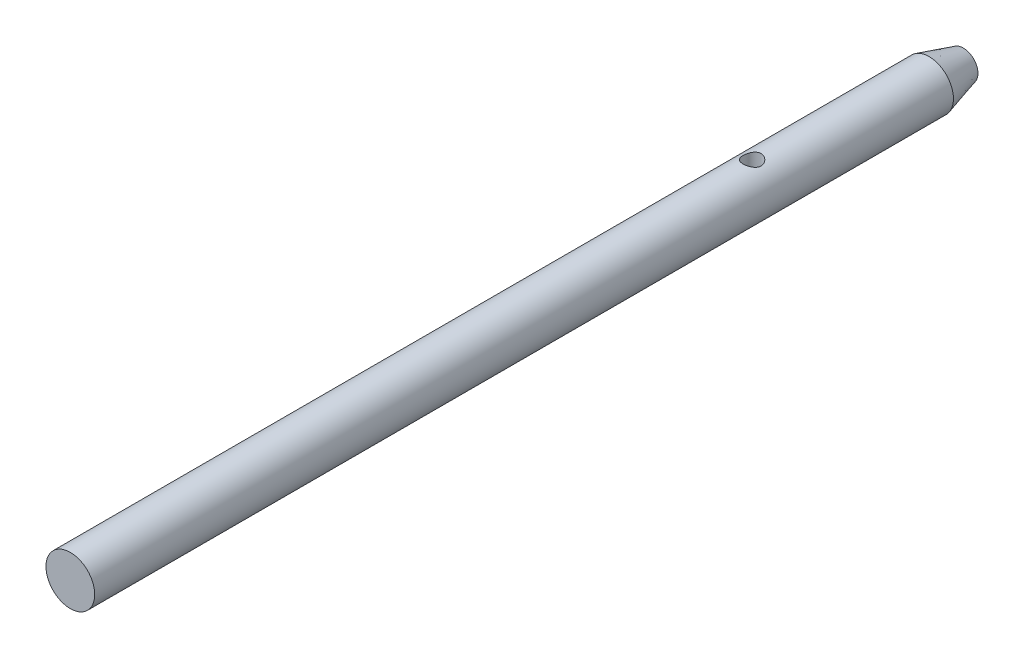
ISO-10303-21;
HEADER;
FILE_DESCRIPTION(('STEP AP214'),'2;1');
FILE_NAME('part.step','',(''),(''),'','','');
FILE_SCHEMA(('AUTOMOTIVE_DESIGN { 1 0 10303 214 1 1 1 1 }'));
ENDSEC;
DATA;
#1=APPLICATION_CONTEXT('core data for automotive mechanical design processes');
#2=APPLICATION_PROTOCOL_DEFINITION('international standard','automotive_design',2000,#1);
#3=PRODUCT_CONTEXT('',#1,'mechanical');
#4=PRODUCT('Part','Part','',(#3));
#5=PRODUCT_RELATED_PRODUCT_CATEGORY('part','',(#4));
#6=PRODUCT_DEFINITION_FORMATION('','',#4);
#7=PRODUCT_DEFINITION_CONTEXT('part definition',#1,'design');
#8=PRODUCT_DEFINITION('design','',#6,#7);
#9=PRODUCT_DEFINITION_SHAPE('','',#8);
#10=(LENGTH_UNIT() NAMED_UNIT(*) SI_UNIT(.MILLI.,.METRE.));
#11=(NAMED_UNIT(*) PLANE_ANGLE_UNIT() SI_UNIT($,.RADIAN.));
#12=(NAMED_UNIT(*) SI_UNIT($,.STERADIAN.) SOLID_ANGLE_UNIT());
#13=UNCERTAINTY_MEASURE_WITH_UNIT(LENGTH_MEASURE(1.E-05),#10,'distance_accuracy_value','');
#14=(GEOMETRIC_REPRESENTATION_CONTEXT(3) GLOBAL_UNCERTAINTY_ASSIGNED_CONTEXT((#13)) GLOBAL_UNIT_ASSIGNED_CONTEXT((#10,
#11,#12)) REPRESENTATION_CONTEXT('',''));
#15=CARTESIAN_POINT('',(0.,0.,0.));
#16=DIRECTION('',(0.,0.,1.));
#17=DIRECTION('',(1.,0.,0.));
#18=AXIS2_PLACEMENT_3D('',#15,#16,#17);
#19=CARTESIAN_POINT('',(0.,0.,78.2));
#20=DIRECTION('',(0.,0.,-1.));
#21=DIRECTION('',(-1.,0.,0.));
#22=AXIS2_PLACEMENT_3D('',#19,#20,#21);
#23=CYLINDRICAL_SURFACE('',#22,2.135);
#24=CARTESIAN_POINT('',(0.,-2.135,19.29));
#25=CARTESIAN_POINT('',(-0.0428238272525146,-2.1350009940098,19.2900013401032));
#26=CARTESIAN_POINT('',(-0.085638357309757,-2.1337002612511,19.2865070010426));
#27=CARTESIAN_POINT('',(-0.169990093325728,-2.12864112528912,19.2726767903511));
#28=CARTESIAN_POINT('',(-0.211527445228046,-2.12488300399346,19.2623417034779));
#29=CARTESIAN_POINT('',(-0.292096286958867,-2.11531311575473,19.2352440665917));
#30=CARTESIAN_POINT('',(-0.331132368726044,-2.10950524735474,19.2184937130613));
#31=CARTESIAN_POINT('',(-0.405838231838684,-2.09641609464971,19.179102199385));
#32=CARTESIAN_POINT('',(-0.441507132774192,-2.08913442654936,19.1564595043622));
#33=CARTESIAN_POINT('',(-0.509946974480535,-2.07351338662565,19.1049435094094));
#34=CARTESIAN_POINT('',(-0.542559501226242,-2.06514462926806,19.0758687440301));
#35=CARTESIAN_POINT('',(-0.602572539428274,-2.04843928389962,19.0127416591513));
#36=CARTESIAN_POINT('',(-0.629971516065413,-2.04010270606756,18.9786878790791));
#37=CARTESIAN_POINT('',(-0.679773875960378,-2.02406609291131,18.9050369260246));
#38=CARTESIAN_POINT('',(-0.701955732021397,-2.01640087631867,18.8652816203101));
#39=CARTESIAN_POINT('',(-0.739248245154464,-2.00303081190102,18.7822761745771));
#40=CARTESIAN_POINT('',(-0.754361641878282,-1.99732520478256,18.7390273962224));
#41=CARTESIAN_POINT('',(-0.77646666746385,-1.98883394910982,18.6520839605847));
#42=CARTESIAN_POINT('',(-0.783760003468851,-1.9859402684505,18.6084769127366));
#43=CARTESIAN_POINT('',(-0.790961267136431,-1.98308390868599,18.5205692854069));
#44=CARTESIAN_POINT('',(-0.790872142551026,-1.98312005972448,18.4762689897974));
#45=CARTESIAN_POINT('',(-0.783542156409132,-1.98602593820376,18.3909682173418));
#46=CARTESIAN_POINT('',(-0.776716560523546,-1.98873113118037,18.3499254196212));
#47=CARTESIAN_POINT('',(-0.756792752812186,-1.99639737240981,18.2696154024085));
#48=CARTESIAN_POINT('',(-0.743693621648512,-2.00135875128379,18.2303484440751));
#49=CARTESIAN_POINT('',(-0.71136124656501,-2.01307961097668,18.1538464392683));
#50=CARTESIAN_POINT('',(-0.692018430804901,-2.01987082265867,18.1166627767925));
#51=CARTESIAN_POINT('',(-0.647824079050184,-2.03447524644867,18.0459472008045));
#52=CARTESIAN_POINT('',(-0.622970676916933,-2.04228880440199,18.0124165301142));
#53=CARTESIAN_POINT('',(-0.566549083268955,-2.05868010145001,17.9476555665624));
#54=CARTESIAN_POINT('',(-0.534648400066002,-2.0672744243697,17.9167184528563));
#55=CARTESIAN_POINT('',(-0.466011737558566,-2.08381932168957,17.8605471978208));
#56=CARTESIAN_POINT('',(-0.429275055022359,-2.09176980219265,17.8353138873685));
#57=CARTESIAN_POINT('',(-0.351277286357768,-2.1062819256944,17.7909545383481));
#58=CARTESIAN_POINT('',(-0.309957626515841,-2.11282143315577,17.7719237361247));
#59=CARTESIAN_POINT('',(-0.22440127916676,-2.1236110947878,17.7411799790662));
#60=CARTESIAN_POINT('',(-0.180165860824172,-2.12786223774206,17.7294638632647));
#61=CARTESIAN_POINT('',(-0.0925029531778528,-2.1334236160906,17.7142401162244));
#62=CARTESIAN_POINT('',(-0.0491529536443193,-2.13487521076022,17.7103375278892));
#63=CARTESIAN_POINT('',(0.0376016534118486,-2.13510916486143,17.7097046980336));
#64=CARTESIAN_POINT('',(0.0810062472026761,-2.13389209764641,17.7129729158887));
#65=CARTESIAN_POINT('',(0.164947028448631,-2.12901880141476,17.7262870400513));
#66=CARTESIAN_POINT('',(0.205529853835498,-2.1254550058492,17.7360762592276));
#67=CARTESIAN_POINT('',(0.284450114556467,-2.11633938227223,17.7618186742843));
#68=CARTESIAN_POINT('',(0.322787256965835,-2.11078729557896,17.7777726722399));
#69=CARTESIAN_POINT('',(0.397376361250218,-2.0980445618673,17.8158967025966));
#70=CARTESIAN_POINT('',(0.43353526677633,-2.09081096072883,17.838234005388));
#71=CARTESIAN_POINT('',(0.501711238114375,-2.07550803529028,17.8883006531025));
#72=CARTESIAN_POINT('',(0.533726796945283,-2.06743840882917,17.9160319507536));
#73=CARTESIAN_POINT('',(0.594596845798324,-2.05078801172393,17.97794301208));
#74=CARTESIAN_POINT('',(0.623170812261933,-2.04220410524591,18.0123984525931));
#75=CARTESIAN_POINT('',(0.674184074189231,-2.02593678452183,18.0857865449927));
#76=CARTESIAN_POINT('',(0.696622894927866,-2.01825343998569,18.1247195430125));
#77=CARTESIAN_POINT('',(0.734732194833676,-2.00469605337354,18.2062344042863));
#78=CARTESIAN_POINT('',(0.750380651462302,-1.99882791579257,18.2488276111607));
#79=CARTESIAN_POINT('',(0.774184352563577,-1.98973091686073,18.3363211483014));
#80=CARTESIAN_POINT('',(0.782344066905023,-1.98650048124964,18.3812200854041));
#81=CARTESIAN_POINT('',(0.790544989748982,-1.98325016337511,18.4690199820063));
#82=CARTESIAN_POINT('',(0.791062925351209,-1.98304176816561,18.5118698191028));
#83=CARTESIAN_POINT('',(0.785180987190091,-1.98537795865399,18.5970114384919));
#84=CARTESIAN_POINT('',(0.778781734233246,-1.98792229729845,18.6393032705198));
#85=CARTESIAN_POINT('',(0.759614417893488,-1.99532229831176,18.720889328424));
#86=CARTESIAN_POINT('',(0.747035916789874,-2.00010898038455,18.7602348755795));
#87=CARTESIAN_POINT('',(0.716032262318212,-2.01141585481088,18.8362812631782));
#88=CARTESIAN_POINT('',(0.697605649861772,-2.0179364797127,18.8729814408015));
#89=CARTESIAN_POINT('',(0.654328772892164,-2.03239368747917,18.9447457343013));
#90=CARTESIAN_POINT('',(0.629196981181888,-2.04038582892592,18.9796287557718));
#91=CARTESIAN_POINT('',(0.573663824928454,-2.05668945480902,19.0448349487086));
#92=CARTESIAN_POINT('',(0.54326080829938,-2.06500103872617,19.0751566850142));
#93=CARTESIAN_POINT('',(0.476152929516309,-2.08152744529652,19.1319889157094));
#94=CARTESIAN_POINT('',(0.439202195132158,-2.08971464340947,19.1582183778302));
#95=CARTESIAN_POINT('',(0.361131124585872,-2.10461087772527,19.204083562761));
#96=CARTESIAN_POINT('',(0.320010649510992,-2.11131986465864,19.2237190658025));
#97=CARTESIAN_POINT('',(0.23334390006495,-2.12267357415785,19.2562136303387));
#98=CARTESIAN_POINT('',(0.187697765137357,-2.12724489208271,19.268834198597));
#99=CARTESIAN_POINT('',(0.0946967591149705,-2.13340685821257,19.2857246889787));
#100=CARTESIAN_POINT('',(0.0473426981359786,-2.13499890109995,19.289998518486));
#101=CARTESIAN_POINT('',(0.,-2.135,19.29));
#102=B_SPLINE_CURVE_WITH_KNOTS('',3,(#24,#25,#26,#27,#28,#29,#30,#31,#32,#33,#34,#35,#36,#37,
#38,#39,#40,#41,#42,#43,#44,#45,#46,#47,#48,#49,#50,#51,#52,#53,#54,#55,#56,#57,#58,#59,#60,#61,
#62,#63,#64,#65,#66,#67,#68,#69,#70,#71,#72,#73,#74,#75,#76,#77,#78,#79,#80,#81,#82,#83,#84,#85,
#86,#87,#88,#89,#90,#91,#92,#93,#94,#95,#96,#97,#98,#99,#100,#101),.UNSPECIFIED.,.T.,.F.,(4,2,2,
2,2,2,2,2,2,2,2,2,2,2,2,2,2,2,2,2,2,2,2,2,2,2,2,2,2,2,2,2,2,2,2,2,2,2,4),(0.,0.128296906151909,
0.256579096872609,0.384618602955328,0.512691495075932,0.645557490133345,0.778462539355701,
0.916269570445694,1.0540231447953,1.18624628604036,1.31841663199489,1.44291805088535,
1.56743772007746,1.6942736561903,1.82115261058118,1.95631650778028,2.09150008173078,
2.22867098807368,2.36578257631508,2.49576835788818,2.62572621517235,2.75084900285138,
2.87598807524934,3.00476618121446,3.13359099435013,3.26968911584709,3.4057977653605,
3.54234460250331,3.67880988467715,3.80672312123309,3.93462487873572,4.05882725883751,
4.18306065149938,4.31368056914014,4.44434149939483,4.5818128805035,4.7192888429054,
4.86119038481296,5.00302548198714),.UNSPECIFIED.);
#103=CARTESIAN_POINT('',(0.,-2.135,19.29));
#104=VERTEX_POINT('',#103);
#105=EDGE_CURVE('E58',#104,#104,#102,.T.);
#106=ORIENTED_EDGE('',*,*,#105,.F.);
#107=EDGE_LOOP('',(#106));
#108=FACE_BOUND('',#107,.T.);
#109=CARTESIAN_POINT('',(0.,2.135,17.71));
#110=CARTESIAN_POINT('',(0.04282382725251,2.1350009940098,17.7099986598968));
#111=CARTESIAN_POINT('',(0.0856383573097523,2.1337002612511,17.7134929989574));
#112=CARTESIAN_POINT('',(0.169990093325723,2.12864112528912,17.7273232096489));
#113=CARTESIAN_POINT('',(0.211527445228041,2.12488300399346,17.7376582965221));
#114=CARTESIAN_POINT('',(0.292096286958862,2.11531311575473,17.7647559334083));
#115=CARTESIAN_POINT('',(0.331132368726039,2.10950524735474,17.7815062869387));
#116=CARTESIAN_POINT('',(0.405838231838679,2.09641609464971,17.820897800615));
#117=CARTESIAN_POINT('',(0.441507132774188,2.08913442654937,17.8435404956378));
#118=CARTESIAN_POINT('',(0.509946974480531,2.07351338662565,17.8950564905906));
#119=CARTESIAN_POINT('',(0.542559501226237,2.06514462926806,17.9241312559699));
#120=CARTESIAN_POINT('',(0.602572539428269,2.04843928389962,17.9872583408487));
#121=CARTESIAN_POINT('',(0.629971516065409,2.04010270606756,18.0213121209209));
#122=CARTESIAN_POINT('',(0.679773875960374,2.02406609291131,18.0949630739754));
#123=CARTESIAN_POINT('',(0.701955732021394,2.01640087631867,18.1347183796899));
#124=CARTESIAN_POINT('',(0.739248245154461,2.00303081190102,18.2177238254229));
#125=CARTESIAN_POINT('',(0.754361641878278,1.99732520478256,18.2609726037776));
#126=CARTESIAN_POINT('',(0.776466667463845,1.98883394910982,18.3479160394153));
#127=CARTESIAN_POINT('',(0.783760003468847,1.9859402684505,18.3915230872634));
#128=CARTESIAN_POINT('',(0.790961267136426,1.98308390868599,18.4794307145931));
#129=CARTESIAN_POINT('',(0.790872142551021,1.98312005972448,18.5237310102026));
#130=CARTESIAN_POINT('',(0.783542156409127,1.98602593820376,18.6090317826582));
#131=CARTESIAN_POINT('',(0.776716560523542,1.98873113118037,18.6500745803788));
#132=CARTESIAN_POINT('',(0.756792752812181,1.99639737240981,18.7303845975915));
#133=CARTESIAN_POINT('',(0.743693621648508,2.00135875128379,18.7696515559249));
#134=CARTESIAN_POINT('',(0.711361246565005,2.01307961097669,18.8461535607317));
#135=CARTESIAN_POINT('',(0.692018430804897,2.01987082265867,18.8833372232075));
#136=CARTESIAN_POINT('',(0.647824079050179,2.03447524644867,18.9540527991955));
#137=CARTESIAN_POINT('',(0.622970676916928,2.04228880440199,18.9875834698858));
#138=CARTESIAN_POINT('',(0.566549083268951,2.05868010145001,19.0523444334376));
#139=CARTESIAN_POINT('',(0.534648400066,2.0672744243697,19.0832815471437));
#140=CARTESIAN_POINT('',(0.466011737558565,2.08381932168957,19.1394528021792));
#141=CARTESIAN_POINT('',(0.429275055022358,2.09176980219265,19.1646861126315));
#142=CARTESIAN_POINT('',(0.351277286357766,2.1062819256944,19.2090454616519));
#143=CARTESIAN_POINT('',(0.309957626515838,2.11282143315577,19.2280762638753));
#144=CARTESIAN_POINT('',(0.224401279166757,2.1236110947878,19.2588200209337));
#145=CARTESIAN_POINT('',(0.180165860824168,2.12786223774206,19.2705361367353));
#146=CARTESIAN_POINT('',(0.0925029531778487,2.13342361609059,19.2857598837756));
#147=CARTESIAN_POINT('',(0.0491529536443154,2.13487521076022,19.2896624721108));
#148=CARTESIAN_POINT('',(-0.0376016534118525,2.13510916486143,19.2902953019664));
#149=CARTESIAN_POINT('',(-0.0810062472026801,2.13389209764641,19.2870270841113));
#150=CARTESIAN_POINT('',(-0.164947028448636,2.12901880141476,19.2737129599486));
#151=CARTESIAN_POINT('',(-0.205529853835503,2.1254550058492,19.2639237407724));
#152=CARTESIAN_POINT('',(-0.284450114556471,2.11633938227223,19.2381813257157));
#153=CARTESIAN_POINT('',(-0.322787256965839,2.11078729557896,19.2222273277601));
#154=CARTESIAN_POINT('',(-0.397376361250221,2.0980445618673,19.1841032974034));
#155=CARTESIAN_POINT('',(-0.433535266776332,2.09081096072883,19.161765994612));
#156=CARTESIAN_POINT('',(-0.501711238114377,2.07550803529028,19.1116993468975));
#157=CARTESIAN_POINT('',(-0.533726796945286,2.06743840882917,19.0839680492464));
#158=CARTESIAN_POINT('',(-0.594596845798329,2.05078801172393,19.02205698792));
#159=CARTESIAN_POINT('',(-0.623170812261938,2.0422041052459,18.9876015474069));
#160=CARTESIAN_POINT('',(-0.674184074189236,2.02593678452183,18.9142134550073));
#161=CARTESIAN_POINT('',(-0.696622894927872,2.01825343998569,18.8752804569875));
#162=CARTESIAN_POINT('',(-0.734732194833681,2.00469605337354,18.7937655957137));
#163=CARTESIAN_POINT('',(-0.750380651462307,1.99882791579257,18.7511723888393));
#164=CARTESIAN_POINT('',(-0.774184352563582,1.98973091686073,18.6636788516986));
#165=CARTESIAN_POINT('',(-0.782344066905027,1.98650048124964,18.6187799145959));
#166=CARTESIAN_POINT('',(-0.790544989748987,1.9832501633751,18.5309800179937));
#167=CARTESIAN_POINT('',(-0.791062925351214,1.98304176816561,18.4881301808972));
#168=CARTESIAN_POINT('',(-0.785180987190095,1.98537795865398,18.4029885615081));
#169=CARTESIAN_POINT('',(-0.778781734233251,1.98792229729845,18.3606967294802));
#170=CARTESIAN_POINT('',(-0.759614417893492,1.99532229831176,18.279110671576));
#171=CARTESIAN_POINT('',(-0.747035916789878,2.00010898038454,18.2397651244205));
#172=CARTESIAN_POINT('',(-0.716032262318217,2.01141585481088,18.1637187368218));
#173=CARTESIAN_POINT('',(-0.697605649861776,2.0179364797127,18.1270185591985));
#174=CARTESIAN_POINT('',(-0.654328772892169,2.03239368747917,18.0552542656987));
#175=CARTESIAN_POINT('',(-0.629196981181893,2.04038582892592,18.0203712442282));
#176=CARTESIAN_POINT('',(-0.573663824928459,2.05668945480902,17.9551650512914));
#177=CARTESIAN_POINT('',(-0.543260808299386,2.06500103872616,17.9248433149858));
#178=CARTESIAN_POINT('',(-0.476152929516314,2.08152744529652,17.8680110842906));
#179=CARTESIAN_POINT('',(-0.439202195132161,2.08971464340947,17.8417816221698));
#180=CARTESIAN_POINT('',(-0.361131124585875,2.10461087772527,17.795916437239));
#181=CARTESIAN_POINT('',(-0.320010649510996,2.11131986465864,17.7762809341975));
#182=CARTESIAN_POINT('',(-0.233343900064955,2.12267357415785,17.7437863696613));
#183=CARTESIAN_POINT('',(-0.187697765137363,2.12724489208271,17.731165801403));
#184=CARTESIAN_POINT('',(-0.0946967591149755,2.13340685821257,17.7142753110213));
#185=CARTESIAN_POINT('',(-0.0473426981359833,2.13499890109995,17.710001481514));
#186=CARTESIAN_POINT('',(0.,2.135,17.71));
#187=B_SPLINE_CURVE_WITH_KNOTS('',3,(#109,#110,#111,#112,#113,#114,#115,#116,#117,#118,#119,
#120,#121,#122,#123,#124,#125,#126,#127,#128,#129,#130,#131,#132,#133,#134,#135,#136,#137,#138,
#139,#140,#141,#142,#143,#144,#145,#146,#147,#148,#149,#150,#151,#152,#153,#154,#155,#156,#157,
#158,#159,#160,#161,#162,#163,#164,#165,#166,#167,#168,#169,#170,#171,#172,#173,#174,#175,#176,
#177,#178,#179,#180,#181,#182,#183,#184,#185,#186),.UNSPECIFIED.,.T.,.F.,(4,2,2,2,2,2,2,2,2,2,2,
2,2,2,2,2,2,2,2,2,2,2,2,2,2,2,2,2,2,2,2,2,2,2,2,2,2,2,4),(0.,0.128296906151909,
0.256579096872608,0.384618602955328,0.512691495075932,0.645557490133345,0.7784625393557,
0.916269570445701,1.0540231447953,1.18624628604036,1.31841663199489,1.44291805088535,
1.56743772007746,1.6942736561903,1.82115261058118,1.95631650778027,2.09150008173078,
2.22867098807368,2.36578257631507,2.49576835788818,2.62572621517235,2.75084900285138,
2.87598807524933,3.00476618121446,3.13359099435012,3.26968911584709,3.4057977653605,
3.54234460250331,3.67880988467715,3.80672312123309,3.93462487873572,4.05882725883751,
4.18306065149938,4.31368056914013,4.44434149939483,4.5818128805035,4.7192888429054,
4.86119038481296,5.00302548198714),.UNSPECIFIED.);
#188=CARTESIAN_POINT('',(0.,2.135,17.71));
#189=VERTEX_POINT('',#188);
#190=EDGE_CURVE('E68',#189,#189,#187,.T.);
#191=ORIENTED_EDGE('',*,*,#190,.T.);
#192=EDGE_LOOP('',(#191));
#193=FACE_BOUND('',#192,.T.);
#194=CARTESIAN_POINT('',(0.,0.,3.));
#195=DIRECTION('',(0.,0.,1.));
#196=DIRECTION('',(1.,0.,0.));
#197=AXIS2_PLACEMENT_3D('',#194,#195,#196);
#198=CIRCLE('',#197,2.135);
#199=CARTESIAN_POINT('',(2.135,0.,3.));
#200=VERTEX_POINT('',#199);
#201=EDGE_CURVE('E50',#200,#200,#198,.T.);
#202=ORIENTED_EDGE('',*,*,#201,.T.);
#203=EDGE_LOOP('',(#202));
#204=FACE_BOUND('',#203,.T.);
#205=CARTESIAN_POINT('',(0.,0.,78.2));
#206=DIRECTION('',(0.,0.,1.));
#207=DIRECTION('',(1.,0.,0.));
#208=AXIS2_PLACEMENT_3D('',#205,#206,#207);
#209=CIRCLE('',#208,2.135);
#210=CARTESIAN_POINT('',(2.135,0.,78.2));
#211=VERTEX_POINT('',#210);
#212=EDGE_CURVE('E54',#211,#211,#209,.T.);
#213=ORIENTED_EDGE('',*,*,#212,.F.);
#214=EDGE_LOOP('',(#213));
#215=FACE_BOUND('',#214,.T.);
#216=ADVANCED_FACE('F43',(#108,#193,#204,#215),#23,.T.);
#217=CARTESIAN_POINT('',(0.,0.,78.2));
#218=DIRECTION('',(0.,0.,1.));
#219=DIRECTION('',(1.,0.,0.));
#220=AXIS2_PLACEMENT_3D('',#217,#218,#219);
#221=PLANE('',#220);
#222=ORIENTED_EDGE('',*,*,#212,.T.);
#223=EDGE_LOOP('',(#222));
#224=FACE_BOUND('',#223,.T.);
#225=ADVANCED_FACE('F82',(#224),#221,.T.);
#226=CARTESIAN_POINT('',(0.,0.,0.));
#227=DIRECTION('',(0.,0.,1.));
#228=DIRECTION('',(1.,0.,0.));
#229=AXIS2_PLACEMENT_3D('',#226,#227,#228);
#230=PLANE('',#229);
#231=CARTESIAN_POINT('',(0.,0.,0.));
#232=DIRECTION('',(0.,0.,1.));
#233=DIRECTION('',(1.,0.,0.));
#234=AXIS2_PLACEMENT_3D('',#231,#232,#233);
#235=CIRCLE('',#234,1.28499999999998);
#236=CARTESIAN_POINT('',(1.28499999999998,0.,0.));
#237=VERTEX_POINT('',#236);
#238=EDGE_CURVE('E10',#237,#237,#235,.F.);
#239=ORIENTED_EDGE('',*,*,#238,.T.);
#240=EDGE_LOOP('',(#239));
#241=FACE_BOUND('',#240,.T.);
#242=ADVANCED_FACE('F85',(#241),#230,.F.);
#243=CARTESIAN_POINT('',(0.,0.,3.));
#244=DIRECTION('',(0.,0.,1.));
#245=DIRECTION('',(1.,0.,0.));
#246=AXIS2_PLACEMENT_3D('',#243,#244,#245);
#247=CONICAL_SURFACE('',#246,2.135,0.276097019395443);
#248=ORIENTED_EDGE('',*,*,#238,.F.);
#249=EDGE_LOOP('',(#248));
#250=FACE_BOUND('',#249,.T.);
#251=ORIENTED_EDGE('',*,*,#201,.F.);
#252=EDGE_LOOP('',(#251));
#253=FACE_BOUND('',#252,.T.);
#254=ADVANCED_FACE('F45',(#250,#253),#247,.T.);
#255=CARTESIAN_POINT('',(0.,-2.136,18.5));
#256=DIRECTION('',(0.,1.,0.));
#257=DIRECTION('',(0.,0.,1.));
#258=AXIS2_PLACEMENT_3D('',#255,#256,#257);
#259=CYLINDRICAL_SURFACE('',#258,0.79);
#260=ORIENTED_EDGE('',*,*,#105,.T.);
#261=EDGE_LOOP('',(#260));
#262=FACE_BOUND('',#261,.T.);
#263=ORIENTED_EDGE('',*,*,#190,.F.);
#264=EDGE_LOOP('',(#263));
#265=FACE_BOUND('',#264,.T.);
#266=ADVANCED_FACE('F74',(#262,#265),#259,.F.);
#267=CLOSED_SHELL('',(#216,#225,#242,#254,#266));
#268=MANIFOLD_SOLID_BREP('B2',#267);
#269=ADVANCED_BREP_SHAPE_REPRESENTATION('',(#18,#268),#14);
#270=SHAPE_DEFINITION_REPRESENTATION(#9,#269);
ENDSEC;
END-ISO-10303-21;
